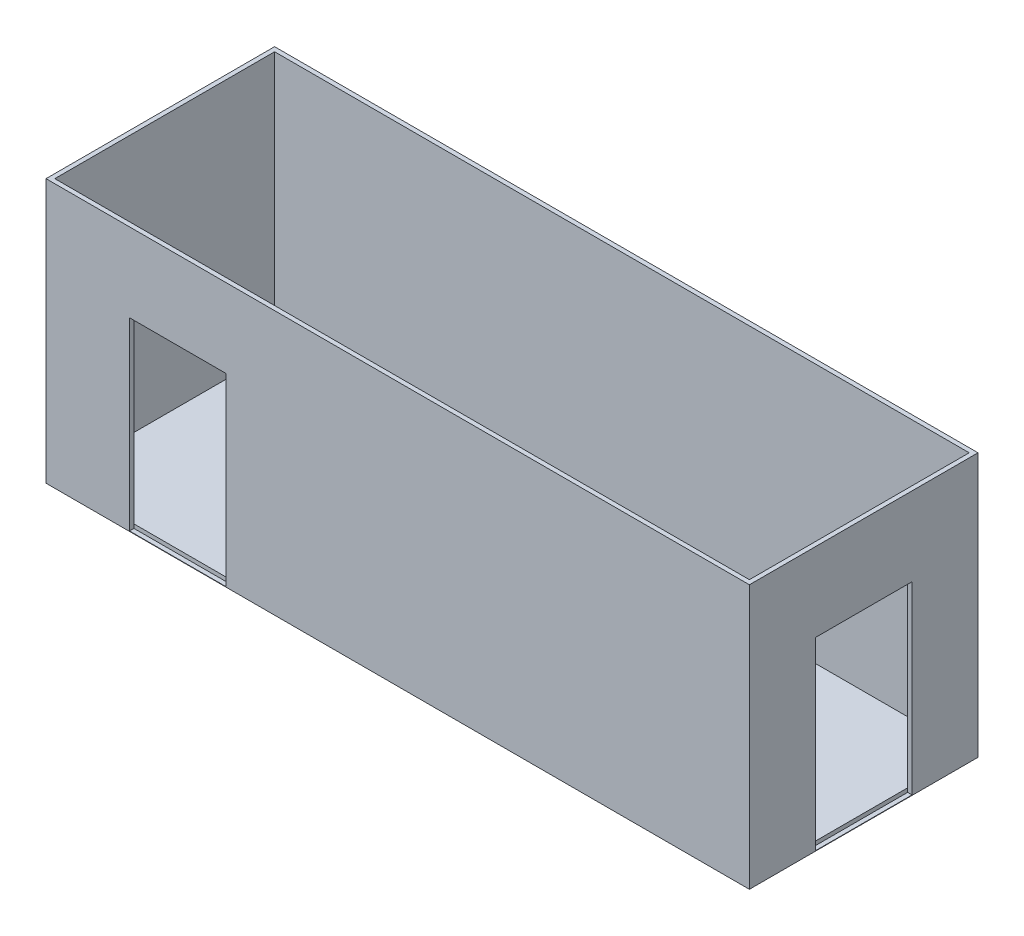
ISO-10303-21;
HEADER;
FILE_DESCRIPTION(('STEP AP214'),'2;1');
FILE_NAME('part.step','',(''),(''),'','','');
FILE_SCHEMA(('AUTOMOTIVE_DESIGN { 1 0 10303 214 1 1 1 1 }'));
ENDSEC;
DATA;
#1=APPLICATION_CONTEXT('core data for automotive mechanical design processes');
#2=APPLICATION_PROTOCOL_DEFINITION('international standard','automotive_design',2000,#1);
#3=PRODUCT_CONTEXT('',#1,'mechanical');
#4=PRODUCT('Part','Part','',(#3));
#5=PRODUCT_RELATED_PRODUCT_CATEGORY('part','',(#4));
#6=PRODUCT_DEFINITION_FORMATION('','',#4);
#7=PRODUCT_DEFINITION_CONTEXT('part definition',#1,'design');
#8=PRODUCT_DEFINITION('design','',#6,#7);
#9=PRODUCT_DEFINITION_SHAPE('','',#8);
#10=(LENGTH_UNIT() NAMED_UNIT(*) SI_UNIT(.MILLI.,.METRE.));
#11=(NAMED_UNIT(*) PLANE_ANGLE_UNIT() SI_UNIT($,.RADIAN.));
#12=(NAMED_UNIT(*) SI_UNIT($,.STERADIAN.) SOLID_ANGLE_UNIT());
#13=UNCERTAINTY_MEASURE_WITH_UNIT(LENGTH_MEASURE(1.E-05),#10,'distance_accuracy_value','');
#14=(GEOMETRIC_REPRESENTATION_CONTEXT(3) GLOBAL_UNCERTAINTY_ASSIGNED_CONTEXT((#13)) GLOBAL_UNIT_ASSIGNED_CONTEXT((#10,
#11,#12)) REPRESENTATION_CONTEXT('',''));
#15=CARTESIAN_POINT('',(0.,0.,0.));
#16=DIRECTION('',(0.,0.,1.));
#17=DIRECTION('',(1.,0.,0.));
#18=AXIS2_PLACEMENT_3D('',#15,#16,#17);
#19=CARTESIAN_POINT('',(-4000.,3000.,1300.));
#20=DIRECTION('',(1.,0.,0.));
#21=DIRECTION('',(0.,0.,-1.));
#22=AXIS2_PLACEMENT_3D('',#19,#20,#21);
#23=PLANE('',#22);
#24=DIRECTION('',(0.,0.,1.));
#25=VECTOR('',#24,1.);
#26=CARTESIAN_POINT('',(-4000.,0.,1300.));
#27=LINE('',#26,#25);
#28=CARTESIAN_POINT('',(-4000.,0.,-1300.));
#29=VERTEX_POINT('',#28);
#30=CARTESIAN_POINT('',(-4000.,0.,1300.));
#31=VERTEX_POINT('',#30);
#32=EDGE_CURVE('E237',#29,#31,#27,.T.);
#33=ORIENTED_EDGE('',*,*,#32,.T.);
#34=DIRECTION('',(0.,-1.,0.));
#35=VECTOR('',#34,1.);
#36=CARTESIAN_POINT('',(-4000.,3000.,1300.));
#37=LINE('',#36,#35);
#38=CARTESIAN_POINT('',(-4000.,3000.,1300.));
#39=VERTEX_POINT('',#38);
#40=EDGE_CURVE('E11',#39,#31,#37,.T.);
#41=ORIENTED_EDGE('',*,*,#40,.F.);
#42=DIRECTION('',(0.,0.,1.));
#43=VECTOR('',#42,1.);
#44=CARTESIAN_POINT('',(-4000.,3000.,1300.));
#45=LINE('',#44,#43);
#46=CARTESIAN_POINT('',(-4000.,3000.,-1300.));
#47=VERTEX_POINT('',#46);
#48=EDGE_CURVE('E266',#47,#39,#45,.T.);
#49=ORIENTED_EDGE('',*,*,#48,.F.);
#50=DIRECTION('',(0.,-1.,0.));
#51=VECTOR('',#50,1.);
#52=CARTESIAN_POINT('',(-4000.,3000.,-1300.));
#53=LINE('',#52,#51);
#54=EDGE_CURVE('E276',#47,#29,#53,.T.);
#55=ORIENTED_EDGE('',*,*,#54,.T.);
#56=EDGE_LOOP('',(#33,#41,#49,#55));
#57=FACE_BOUND('',#56,.T.);
#58=ADVANCED_FACE('F33',(#57),#23,.F.);
#59=CARTESIAN_POINT('',(4000.,3000.,1300.));
#60=DIRECTION('',(0.,0.,-1.));
#61=DIRECTION('',(-1.,0.,0.));
#62=AXIS2_PLACEMENT_3D('',#59,#60,#61);
#63=PLANE('',#62);
#64=DIRECTION('',(1.,0.,0.));
#65=VECTOR('',#64,1.);
#66=CARTESIAN_POINT('',(-3050.,4.99999999999989,1300.));
#67=LINE('',#66,#65);
#68=CARTESIAN_POINT('',(-3050.,4.99999999999989,1300.));
#69=VERTEX_POINT('',#68);
#70=CARTESIAN_POINT('',(-1950.,4.99999999999989,1300.));
#71=VERTEX_POINT('',#70);
#72=EDGE_CURVE('E213',#69,#71,#67,.T.);
#73=ORIENTED_EDGE('',*,*,#72,.F.);
#74=DIRECTION('',(0.,-1.,0.));
#75=VECTOR('',#74,1.);
#76=CARTESIAN_POINT('',(-3050.,2105.,1300.));
#77=LINE('',#76,#75);
#78=CARTESIAN_POINT('',(-3050.,2105.,1300.));
#79=VERTEX_POINT('',#78);
#80=EDGE_CURVE('E194',#79,#69,#77,.T.);
#81=ORIENTED_EDGE('',*,*,#80,.F.);
#82=DIRECTION('',(-1.,0.,0.));
#83=VECTOR('',#82,1.);
#84=CARTESIAN_POINT('',(-3050.,2105.,1300.));
#85=LINE('',#84,#83);
#86=CARTESIAN_POINT('',(-1950.,2105.,1300.));
#87=VERTEX_POINT('',#86);
#88=EDGE_CURVE('E219',#87,#79,#85,.T.);
#89=ORIENTED_EDGE('',*,*,#88,.F.);
#90=DIRECTION('',(0.,1.,0.));
#91=VECTOR('',#90,1.);
#92=CARTESIAN_POINT('',(-1950.,2105.,1300.));
#93=LINE('',#92,#91);
#94=EDGE_CURVE('E216',#71,#87,#93,.T.);
#95=ORIENTED_EDGE('',*,*,#94,.F.);
#96=EDGE_LOOP('',(#73,#81,#89,#95));
#97=FACE_BOUND('',#96,.T.);
#98=DIRECTION('',(1.,0.,0.));
#99=VECTOR('',#98,1.);
#100=CARTESIAN_POINT('',(4000.,0.,1300.));
#101=LINE('',#100,#99);
#102=CARTESIAN_POINT('',(4000.,0.,1300.));
#103=VERTEX_POINT('',#102);
#104=EDGE_CURVE('E279',#31,#103,#101,.T.);
#105=ORIENTED_EDGE('',*,*,#104,.T.);
#106=DIRECTION('',(0.,-1.,0.));
#107=VECTOR('',#106,1.);
#108=CARTESIAN_POINT('',(4000.,3000.,1300.));
#109=LINE('',#108,#107);
#110=CARTESIAN_POINT('',(4000.,3000.,1300.));
#111=VERTEX_POINT('',#110);
#112=EDGE_CURVE('E40',#111,#103,#109,.T.);
#113=ORIENTED_EDGE('',*,*,#112,.F.);
#114=DIRECTION('',(1.,0.,0.));
#115=VECTOR('',#114,1.);
#116=CARTESIAN_POINT('',(4000.,3000.,1300.));
#117=LINE('',#116,#115);
#118=EDGE_CURVE('E269',#39,#111,#117,.T.);
#119=ORIENTED_EDGE('',*,*,#118,.F.);
#120=ORIENTED_EDGE('',*,*,#40,.T.);
#121=EDGE_LOOP('',(#105,#113,#119,#120));
#122=FACE_BOUND('',#121,.T.);
#123=ADVANCED_FACE('F309',(#97,#122),#63,.F.);
#124=CARTESIAN_POINT('',(4000.,3000.,1300.));
#125=DIRECTION('',(-1.,0.,0.));
#126=DIRECTION('',(0.,0.,1.));
#127=AXIS2_PLACEMENT_3D('',#124,#125,#126);
#128=PLANE('',#127);
#129=DIRECTION('',(0.,0.,-1.));
#130=VECTOR('',#129,1.);
#131=CARTESIAN_POINT('',(4000.,4.99999999999989,550.));
#132=LINE('',#131,#130);
#133=CARTESIAN_POINT('',(4000.,4.99999999999989,550.));
#134=VERTEX_POINT('',#133);
#135=CARTESIAN_POINT('',(4000.,4.99999999999989,-550.));
#136=VERTEX_POINT('',#135);
#137=EDGE_CURVE('E185',#134,#136,#132,.T.);
#138=ORIENTED_EDGE('',*,*,#137,.F.);
#139=DIRECTION('',(0.,-1.,0.));
#140=VECTOR('',#139,1.);
#141=CARTESIAN_POINT('',(4000.,2105.,550.));
#142=LINE('',#141,#140);
#143=CARTESIAN_POINT('',(4000.,2105.,550.));
#144=VERTEX_POINT('',#143);
#145=EDGE_CURVE('E47',#144,#134,#142,.T.);
#146=ORIENTED_EDGE('',*,*,#145,.F.);
#147=DIRECTION('',(0.,0.,1.));
#148=VECTOR('',#147,1.);
#149=CARTESIAN_POINT('',(4000.,2105.,550.));
#150=LINE('',#149,#148);
#151=CARTESIAN_POINT('',(4000.,2105.,-550.));
#152=VERTEX_POINT('',#151);
#153=EDGE_CURVE('E166',#152,#144,#150,.T.);
#154=ORIENTED_EDGE('',*,*,#153,.F.);
#155=DIRECTION('',(0.,1.,0.));
#156=VECTOR('',#155,1.);
#157=CARTESIAN_POINT('',(4000.,2105.,-550.));
#158=LINE('',#157,#156);
#159=EDGE_CURVE('E187',#136,#152,#158,.T.);
#160=ORIENTED_EDGE('',*,*,#159,.F.);
#161=EDGE_LOOP('',(#138,#146,#154,#160));
#162=FACE_BOUND('',#161,.T.);
#163=DIRECTION('',(0.,0.,-1.));
#164=VECTOR('',#163,1.);
#165=CARTESIAN_POINT('',(4000.,0.,1300.));
#166=LINE('',#165,#164);
#167=CARTESIAN_POINT('',(4000.,0.,-1300.));
#168=VERTEX_POINT('',#167);
#169=EDGE_CURVE('E281',#103,#168,#166,.T.);
#170=ORIENTED_EDGE('',*,*,#169,.T.);
#171=DIRECTION('',(0.,-1.,0.));
#172=VECTOR('',#171,1.);
#173=CARTESIAN_POINT('',(4000.,3000.,-1300.));
#174=LINE('',#173,#172);
#175=CARTESIAN_POINT('',(4000.,3000.,-1300.));
#176=VERTEX_POINT('',#175);
#177=EDGE_CURVE('E286',#176,#168,#174,.T.);
#178=ORIENTED_EDGE('',*,*,#177,.F.);
#179=DIRECTION('',(0.,0.,-1.));
#180=VECTOR('',#179,1.);
#181=CARTESIAN_POINT('',(4000.,3000.,1300.));
#182=LINE('',#181,#180);
#183=EDGE_CURVE('E272',#111,#176,#182,.T.);
#184=ORIENTED_EDGE('',*,*,#183,.F.);
#185=ORIENTED_EDGE('',*,*,#112,.T.);
#186=EDGE_LOOP('',(#170,#178,#184,#185));
#187=FACE_BOUND('',#186,.T.);
#188=ADVANCED_FACE('F293',(#162,#187),#128,.F.);
#189=CARTESIAN_POINT('',(4000.,3000.,-1300.));
#190=DIRECTION('',(0.,0.,1.));
#191=DIRECTION('',(1.,0.,0.));
#192=AXIS2_PLACEMENT_3D('',#189,#190,#191);
#193=PLANE('',#192);
#194=DIRECTION('',(-1.,0.,0.));
#195=VECTOR('',#194,1.);
#196=CARTESIAN_POINT('',(4000.,0.,-1300.));
#197=LINE('',#196,#195);
#198=EDGE_CURVE('E270',#168,#29,#197,.T.);
#199=ORIENTED_EDGE('',*,*,#198,.T.);
#200=ORIENTED_EDGE('',*,*,#54,.F.);
#201=DIRECTION('',(-1.,0.,0.));
#202=VECTOR('',#201,1.);
#203=CARTESIAN_POINT('',(4000.,3000.,-1300.));
#204=LINE('',#203,#202);
#205=EDGE_CURVE('E274',#176,#47,#204,.T.);
#206=ORIENTED_EDGE('',*,*,#205,.F.);
#207=ORIENTED_EDGE('',*,*,#177,.T.);
#208=EDGE_LOOP('',(#199,#200,#206,#207));
#209=FACE_BOUND('',#208,.T.);
#210=ADVANCED_FACE('F302',(#209),#193,.F.);
#211=CARTESIAN_POINT('',(0.,3000.,0.));
#212=DIRECTION('',(0.,1.,0.));
#213=DIRECTION('',(0.,0.,1.));
#214=AXIS2_PLACEMENT_3D('',#211,#212,#213);
#215=PLANE('',#214);
#216=DIRECTION('',(0.,0.,1.));
#217=VECTOR('',#216,1.);
#218=CARTESIAN_POINT('',(-3950.,3000.,1300.));
#219=LINE('',#218,#217);
#220=CARTESIAN_POINT('',(-3950.,3000.,-1250.));
#221=VERTEX_POINT('',#220);
#222=CARTESIAN_POINT('',(-3950.,3000.,1250.));
#223=VERTEX_POINT('',#222);
#224=EDGE_CURVE('E258',#221,#223,#219,.T.);
#225=ORIENTED_EDGE('',*,*,#224,.F.);
#226=DIRECTION('',(-1.,0.,0.));
#227=VECTOR('',#226,1.);
#228=CARTESIAN_POINT('',(4000.,3000.,-1250.));
#229=LINE('',#228,#227);
#230=CARTESIAN_POINT('',(3950.,3000.,-1250.));
#231=VERTEX_POINT('',#230);
#232=EDGE_CURVE('E243',#231,#221,#229,.T.);
#233=ORIENTED_EDGE('',*,*,#232,.F.);
#234=DIRECTION('',(0.,0.,-1.));
#235=VECTOR('',#234,1.);
#236=CARTESIAN_POINT('',(3950.,3000.,1300.));
#237=LINE('',#236,#235);
#238=CARTESIAN_POINT('',(3950.,3000.,1250.));
#239=VERTEX_POINT('',#238);
#240=EDGE_CURVE('E262',#239,#231,#237,.T.);
#241=ORIENTED_EDGE('',*,*,#240,.F.);
#242=DIRECTION('',(1.,0.,0.));
#243=VECTOR('',#242,1.);
#244=CARTESIAN_POINT('',(4000.,3000.,1250.));
#245=LINE('',#244,#243);
#246=EDGE_CURVE('E260',#223,#239,#245,.T.);
#247=ORIENTED_EDGE('',*,*,#246,.F.);
#248=EDGE_LOOP('',(#225,#233,#241,#247));
#249=FACE_BOUND('',#248,.T.);
#250=ORIENTED_EDGE('',*,*,#48,.T.);
#251=ORIENTED_EDGE('',*,*,#118,.T.);
#252=ORIENTED_EDGE('',*,*,#183,.T.);
#253=ORIENTED_EDGE('',*,*,#205,.T.);
#254=EDGE_LOOP('',(#250,#251,#252,#253));
#255=FACE_BOUND('',#254,.T.);
#256=ADVANCED_FACE('F308',(#249,#255),#215,.T.);
#257=CARTESIAN_POINT('',(0.,0.,0.));
#258=DIRECTION('',(0.,1.,0.));
#259=DIRECTION('',(0.,0.,1.));
#260=AXIS2_PLACEMENT_3D('',#257,#258,#259);
#261=PLANE('',#260);
#262=ORIENTED_EDGE('',*,*,#32,.F.);
#263=ORIENTED_EDGE('',*,*,#198,.F.);
#264=ORIENTED_EDGE('',*,*,#169,.F.);
#265=ORIENTED_EDGE('',*,*,#104,.F.);
#266=EDGE_LOOP('',(#262,#263,#264,#265));
#267=FACE_BOUND('',#266,.T.);
#268=ADVANCED_FACE('F299',(#267),#261,.F.);
#269=CARTESIAN_POINT('',(-3950.,3000.,1300.));
#270=DIRECTION('',(1.,0.,0.));
#271=DIRECTION('',(0.,0.,-1.));
#272=AXIS2_PLACEMENT_3D('',#269,#270,#271);
#273=PLANE('',#272);
#274=DIRECTION('',(0.,0.,1.));
#275=VECTOR('',#274,1.);
#276=CARTESIAN_POINT('',(-3950.,49.9999999999998,1300.));
#277=LINE('',#276,#275);
#278=CARTESIAN_POINT('',(-3950.,50.,-1250.));
#279=VERTEX_POINT('',#278);
#280=CARTESIAN_POINT('',(-3950.,50.,1250.));
#281=VERTEX_POINT('',#280);
#282=EDGE_CURVE('E224',#279,#281,#277,.T.);
#283=ORIENTED_EDGE('',*,*,#282,.F.);
#284=DIRECTION('',(0.,-1.,0.));
#285=VECTOR('',#284,1.);
#286=CARTESIAN_POINT('',(-3950.,3000.,-1250.));
#287=LINE('',#286,#285);
#288=EDGE_CURVE('E239',#221,#279,#287,.T.);
#289=ORIENTED_EDGE('',*,*,#288,.F.);
#290=ORIENTED_EDGE('',*,*,#224,.T.);
#291=DIRECTION('',(0.,-1.,0.));
#292=VECTOR('',#291,1.);
#293=CARTESIAN_POINT('',(-3950.,3000.,1250.));
#294=LINE('',#293,#292);
#295=EDGE_CURVE('E234',#223,#281,#294,.T.);
#296=ORIENTED_EDGE('',*,*,#295,.T.);
#297=EDGE_LOOP('',(#283,#289,#290,#296));
#298=FACE_BOUND('',#297,.T.);
#299=ADVANCED_FACE('F324',(#298),#273,.T.);
#300=CARTESIAN_POINT('',(4000.,3000.,1250.));
#301=DIRECTION('',(0.,0.,-1.));
#302=DIRECTION('',(-1.,0.,0.));
#303=AXIS2_PLACEMENT_3D('',#300,#301,#302);
#304=PLANE('',#303);
#305=DIRECTION('',(0.,-1.,0.));
#306=VECTOR('',#305,1.);
#307=CARTESIAN_POINT('',(-3050.,2105.,1250.));
#308=LINE('',#307,#306);
#309=CARTESIAN_POINT('',(-3050.,2105.,1250.));
#310=VERTEX_POINT('',#309);
#311=CARTESIAN_POINT('',(-3050.,49.9999999999998,1250.));
#312=VERTEX_POINT('',#311);
#313=EDGE_CURVE('E198',#310,#312,#308,.T.);
#314=ORIENTED_EDGE('',*,*,#313,.T.);
#315=DIRECTION('',(1.,0.,0.));
#316=VECTOR('',#315,1.);
#317=CARTESIAN_POINT('',(4000.,49.9999999999998,1250.));
#318=LINE('',#317,#316);
#319=EDGE_CURVE('E244',#281,#312,#318,.T.);
#320=ORIENTED_EDGE('',*,*,#319,.F.);
#321=ORIENTED_EDGE('',*,*,#295,.F.);
#322=ORIENTED_EDGE('',*,*,#246,.T.);
#323=DIRECTION('',(0.,-1.,0.));
#324=VECTOR('',#323,1.);
#325=CARTESIAN_POINT('',(3950.,3000.,1250.));
#326=LINE('',#325,#324);
#327=CARTESIAN_POINT('',(3950.,50.,1250.));
#328=VERTEX_POINT('',#327);
#329=EDGE_CURVE('E238',#239,#328,#326,.T.);
#330=ORIENTED_EDGE('',*,*,#329,.T.);
#331=CARTESIAN_POINT('',(-1950.,49.9999999999998,1250.));
#332=VERTEX_POINT('',#331);
#333=EDGE_CURVE('E233',#332,#328,#318,.T.);
#334=ORIENTED_EDGE('',*,*,#333,.F.);
#335=DIRECTION('',(0.,1.,0.));
#336=VECTOR('',#335,1.);
#337=CARTESIAN_POINT('',(-1950.,2105.,1250.));
#338=LINE('',#337,#336);
#339=CARTESIAN_POINT('',(-1950.,2105.,1250.));
#340=VERTEX_POINT('',#339);
#341=EDGE_CURVE('E205',#332,#340,#338,.T.);
#342=ORIENTED_EDGE('',*,*,#341,.T.);
#343=DIRECTION('',(-1.,0.,0.));
#344=VECTOR('',#343,1.);
#345=CARTESIAN_POINT('',(-3050.,2105.,1250.));
#346=LINE('',#345,#344);
#347=EDGE_CURVE('E208',#340,#310,#346,.T.);
#348=ORIENTED_EDGE('',*,*,#347,.T.);
#349=EDGE_LOOP('',(#314,#320,#321,#322,#330,#334,#342,#348));
#350=FACE_BOUND('',#349,.T.);
#351=ADVANCED_FACE('F340',(#350),#304,.T.);
#352=CARTESIAN_POINT('',(3950.,3000.,1300.));
#353=DIRECTION('',(-1.,0.,0.));
#354=DIRECTION('',(0.,0.,1.));
#355=AXIS2_PLACEMENT_3D('',#352,#353,#354);
#356=PLANE('',#355);
#357=DIRECTION('',(0.,-1.,0.));
#358=VECTOR('',#357,1.);
#359=CARTESIAN_POINT('',(3950.,2105.,550.));
#360=LINE('',#359,#358);
#361=CARTESIAN_POINT('',(3950.,2105.,550.));
#362=VERTEX_POINT('',#361);
#363=CARTESIAN_POINT('',(3950.,49.9999999999998,550.));
#364=VERTEX_POINT('',#363);
#365=EDGE_CURVE('E165',#362,#364,#360,.T.);
#366=ORIENTED_EDGE('',*,*,#365,.T.);
#367=DIRECTION('',(0.,0.,-1.));
#368=VECTOR('',#367,1.);
#369=CARTESIAN_POINT('',(3950.,49.9999999999998,1300.));
#370=LINE('',#369,#368);
#371=EDGE_CURVE('E251',#328,#364,#370,.T.);
#372=ORIENTED_EDGE('',*,*,#371,.F.);
#373=ORIENTED_EDGE('',*,*,#329,.F.);
#374=ORIENTED_EDGE('',*,*,#240,.T.);
#375=DIRECTION('',(0.,-1.,0.));
#376=VECTOR('',#375,1.);
#377=CARTESIAN_POINT('',(3950.,3000.,-1250.));
#378=LINE('',#377,#376);
#379=CARTESIAN_POINT('',(3950.,50.,-1250.));
#380=VERTEX_POINT('',#379);
#381=EDGE_CURVE('E242',#231,#380,#378,.T.);
#382=ORIENTED_EDGE('',*,*,#381,.T.);
#383=CARTESIAN_POINT('',(3950.,49.9999999999998,-550.));
#384=VERTEX_POINT('',#383);
#385=EDGE_CURVE('E247',#384,#380,#370,.T.);
#386=ORIENTED_EDGE('',*,*,#385,.F.);
#387=DIRECTION('',(0.,1.,0.));
#388=VECTOR('',#387,1.);
#389=CARTESIAN_POINT('',(3950.,2105.,-550.));
#390=LINE('',#389,#388);
#391=CARTESIAN_POINT('',(3950.,2105.,-550.));
#392=VERTEX_POINT('',#391);
#393=EDGE_CURVE('E177',#384,#392,#390,.T.);
#394=ORIENTED_EDGE('',*,*,#393,.T.);
#395=DIRECTION('',(0.,0.,1.));
#396=VECTOR('',#395,1.);
#397=CARTESIAN_POINT('',(3950.,2105.,550.));
#398=LINE('',#397,#396);
#399=EDGE_CURVE('E174',#392,#362,#398,.T.);
#400=ORIENTED_EDGE('',*,*,#399,.T.);
#401=EDGE_LOOP('',(#366,#372,#373,#374,#382,#386,#394,#400));
#402=FACE_BOUND('',#401,.T.);
#403=ADVANCED_FACE('F336',(#402),#356,.T.);
#404=CARTESIAN_POINT('',(4000.,3000.,-1250.));
#405=DIRECTION('',(0.,0.,1.));
#406=DIRECTION('',(1.,0.,0.));
#407=AXIS2_PLACEMENT_3D('',#404,#405,#406);
#408=PLANE('',#407);
#409=DIRECTION('',(-1.,0.,0.));
#410=VECTOR('',#409,1.);
#411=CARTESIAN_POINT('',(4000.,49.9999999999998,-1250.));
#412=LINE('',#411,#410);
#413=EDGE_CURVE('E254',#380,#279,#412,.T.);
#414=ORIENTED_EDGE('',*,*,#413,.F.);
#415=ORIENTED_EDGE('',*,*,#381,.F.);
#416=ORIENTED_EDGE('',*,*,#232,.T.);
#417=ORIENTED_EDGE('',*,*,#288,.T.);
#418=EDGE_LOOP('',(#414,#415,#416,#417));
#419=FACE_BOUND('',#418,.T.);
#420=ADVANCED_FACE('F332',(#419),#408,.T.);
#421=CARTESIAN_POINT('',(0.,50.,0.));
#422=DIRECTION('',(0.,1.,0.));
#423=DIRECTION('',(0.,0.,1.));
#424=AXIS2_PLACEMENT_3D('',#421,#422,#423);
#425=PLANE('',#424);
#426=ORIENTED_EDGE('',*,*,#282,.T.);
#427=ORIENTED_EDGE('',*,*,#319,.T.);
#428=EDGE_CURVE('E248',#312,#332,#318,.T.);
#429=ORIENTED_EDGE('',*,*,#428,.T.);
#430=ORIENTED_EDGE('',*,*,#333,.T.);
#431=ORIENTED_EDGE('',*,*,#371,.T.);
#432=EDGE_CURVE('E162',#364,#384,#370,.T.);
#433=ORIENTED_EDGE('',*,*,#432,.T.);
#434=ORIENTED_EDGE('',*,*,#385,.T.);
#435=ORIENTED_EDGE('',*,*,#413,.T.);
#436=EDGE_LOOP('',(#426,#427,#429,#430,#431,#433,#434,#435));
#437=FACE_BOUND('',#436,.T.);
#438=ADVANCED_FACE('F328',(#437),#425,.T.);
#439=CARTESIAN_POINT('',(-3050.,2105.,1250.));
#440=DIRECTION('',(-1.,0.,0.));
#441=DIRECTION('',(0.,-1.,0.));
#442=AXIS2_PLACEMENT_3D('',#439,#440,#441);
#443=PLANE('',#442);
#444=ORIENTED_EDGE('',*,*,#80,.T.);
#445=DIRECTION('',(0.,0.,1.));
#446=VECTOR('',#445,1.);
#447=CARTESIAN_POINT('',(-3050.,4.99999999999989,1250.));
#448=LINE('',#447,#446);
#449=CARTESIAN_POINT('',(-3050.,4.99999999999989,1250.));
#450=VERTEX_POINT('',#449);
#451=EDGE_CURVE('E211',#450,#69,#448,.T.);
#452=ORIENTED_EDGE('',*,*,#451,.F.);
#453=EDGE_CURVE('E202',#312,#450,#308,.T.);
#454=ORIENTED_EDGE('',*,*,#453,.F.);
#455=ORIENTED_EDGE('',*,*,#313,.F.);
#456=DIRECTION('',(0.,0.,1.));
#457=VECTOR('',#456,1.);
#458=CARTESIAN_POINT('',(-3050.,2105.,1250.));
#459=LINE('',#458,#457);
#460=EDGE_CURVE('E222',#310,#79,#459,.T.);
#461=ORIENTED_EDGE('',*,*,#460,.T.);
#462=EDGE_LOOP('',(#444,#452,#454,#455,#461));
#463=FACE_BOUND('',#462,.T.);
#464=ADVANCED_FACE('F331',(#463),#443,.F.);
#465=CARTESIAN_POINT('',(-3050.,2105.,1250.));
#466=DIRECTION('',(0.,1.,0.));
#467=DIRECTION('',(0.,0.,1.));
#468=AXIS2_PLACEMENT_3D('',#465,#466,#467);
#469=PLANE('',#468);
#470=ORIENTED_EDGE('',*,*,#88,.T.);
#471=ORIENTED_EDGE('',*,*,#460,.F.);
#472=ORIENTED_EDGE('',*,*,#347,.F.);
#473=DIRECTION('',(0.,0.,1.));
#474=VECTOR('',#473,1.);
#475=CARTESIAN_POINT('',(-1950.,2105.,1250.));
#476=LINE('',#475,#474);
#477=EDGE_CURVE('E225',#340,#87,#476,.T.);
#478=ORIENTED_EDGE('',*,*,#477,.T.);
#479=EDGE_LOOP('',(#470,#471,#472,#478));
#480=FACE_BOUND('',#479,.T.);
#481=ADVANCED_FACE('F350',(#480),#469,.F.);
#482=CARTESIAN_POINT('',(-1950.,2105.,1250.));
#483=DIRECTION('',(1.,0.,0.));
#484=DIRECTION('',(0.,1.,0.));
#485=AXIS2_PLACEMENT_3D('',#482,#483,#484);
#486=PLANE('',#485);
#487=ORIENTED_EDGE('',*,*,#94,.T.);
#488=ORIENTED_EDGE('',*,*,#477,.F.);
#489=ORIENTED_EDGE('',*,*,#341,.F.);
#490=CARTESIAN_POINT('',(-1950.,4.99999999999989,1250.));
#491=VERTEX_POINT('',#490);
#492=EDGE_CURVE('E206',#491,#332,#338,.T.);
#493=ORIENTED_EDGE('',*,*,#492,.F.);
#494=DIRECTION('',(0.,0.,1.));
#495=VECTOR('',#494,1.);
#496=CARTESIAN_POINT('',(-1950.,4.99999999999989,1250.));
#497=LINE('',#496,#495);
#498=EDGE_CURVE('E227',#491,#71,#497,.T.);
#499=ORIENTED_EDGE('',*,*,#498,.T.);
#500=EDGE_LOOP('',(#487,#488,#489,#493,#499));
#501=FACE_BOUND('',#500,.T.);
#502=ADVANCED_FACE('F356',(#501),#486,.F.);
#503=CARTESIAN_POINT('',(-3050.,4.99999999999989,1250.));
#504=DIRECTION('',(0.,-1.,0.));
#505=DIRECTION('',(0.,0.,-1.));
#506=AXIS2_PLACEMENT_3D('',#503,#504,#505);
#507=PLANE('',#506);
#508=ORIENTED_EDGE('',*,*,#72,.T.);
#509=ORIENTED_EDGE('',*,*,#498,.F.);
#510=DIRECTION('',(1.,0.,0.));
#511=VECTOR('',#510,1.);
#512=CARTESIAN_POINT('',(-3050.,4.99999999999989,1250.));
#513=LINE('',#512,#511);
#514=EDGE_CURVE('E201',#450,#491,#513,.T.);
#515=ORIENTED_EDGE('',*,*,#514,.F.);
#516=ORIENTED_EDGE('',*,*,#451,.T.);
#517=EDGE_LOOP('',(#508,#509,#515,#516));
#518=FACE_BOUND('',#517,.T.);
#519=ADVANCED_FACE('F352',(#518),#507,.F.);
#520=CARTESIAN_POINT('',(0.,0.,1250.));
#521=DIRECTION('',(0.,0.,1.));
#522=DIRECTION('',(1.,0.,0.));
#523=AXIS2_PLACEMENT_3D('',#520,#521,#522);
#524=PLANE('',#523);
#525=ORIENTED_EDGE('',*,*,#453,.T.);
#526=ORIENTED_EDGE('',*,*,#514,.T.);
#527=ORIENTED_EDGE('',*,*,#492,.T.);
#528=ORIENTED_EDGE('',*,*,#428,.F.);
#529=EDGE_LOOP('',(#525,#526,#527,#528));
#530=FACE_BOUND('',#529,.T.);
#531=ADVANCED_FACE('F355',(#530),#524,.T.);
#532=CARTESIAN_POINT('',(3950.,2105.,550.));
#533=DIRECTION('',(0.,0.,1.));
#534=DIRECTION('',(0.,-1.,0.));
#535=AXIS2_PLACEMENT_3D('',#532,#533,#534);
#536=PLANE('',#535);
#537=ORIENTED_EDGE('',*,*,#145,.T.);
#538=DIRECTION('',(1.,0.,0.));
#539=VECTOR('',#538,1.);
#540=CARTESIAN_POINT('',(3950.,4.99999999999989,550.));
#541=LINE('',#540,#539);
#542=CARTESIAN_POINT('',(3950.,4.99999999999989,550.));
#543=VERTEX_POINT('',#542);
#544=EDGE_CURVE('E168',#543,#134,#541,.T.);
#545=ORIENTED_EDGE('',*,*,#544,.F.);
#546=EDGE_CURVE('E157',#364,#543,#360,.T.);
#547=ORIENTED_EDGE('',*,*,#546,.F.);
#548=ORIENTED_EDGE('',*,*,#365,.F.);
#549=DIRECTION('',(1.,0.,0.));
#550=VECTOR('',#549,1.);
#551=CARTESIAN_POINT('',(3950.,2105.,550.));
#552=LINE('',#551,#550);
#553=EDGE_CURVE('E192',#362,#144,#552,.T.);
#554=ORIENTED_EDGE('',*,*,#553,.T.);
#555=EDGE_LOOP('',(#537,#545,#547,#548,#554));
#556=FACE_BOUND('',#555,.T.);
#557=ADVANCED_FACE('F169',(#556),#536,.F.);
#558=CARTESIAN_POINT('',(3950.,2105.,550.));
#559=DIRECTION('',(0.,1.,0.));
#560=DIRECTION('',(0.,0.,1.));
#561=AXIS2_PLACEMENT_3D('',#558,#559,#560);
#562=PLANE('',#561);
#563=ORIENTED_EDGE('',*,*,#153,.T.);
#564=ORIENTED_EDGE('',*,*,#553,.F.);
#565=ORIENTED_EDGE('',*,*,#399,.F.);
#566=DIRECTION('',(1.,0.,0.));
#567=VECTOR('',#566,1.);
#568=CARTESIAN_POINT('',(3950.,2105.,-550.));
#569=LINE('',#568,#567);
#570=EDGE_CURVE('E195',#392,#152,#569,.T.);
#571=ORIENTED_EDGE('',*,*,#570,.T.);
#572=EDGE_LOOP('',(#563,#564,#565,#571));
#573=FACE_BOUND('',#572,.T.);
#574=ADVANCED_FACE('F369',(#573),#562,.F.);
#575=CARTESIAN_POINT('',(3950.,2105.,-550.));
#576=DIRECTION('',(0.,0.,-1.));
#577=DIRECTION('',(0.,1.,0.));
#578=AXIS2_PLACEMENT_3D('',#575,#576,#577);
#579=PLANE('',#578);
#580=ORIENTED_EDGE('',*,*,#159,.T.);
#581=ORIENTED_EDGE('',*,*,#570,.F.);
#582=ORIENTED_EDGE('',*,*,#393,.F.);
#583=CARTESIAN_POINT('',(3950.,4.99999999999989,-550.));
#584=VERTEX_POINT('',#583);
#585=EDGE_CURVE('E55',#584,#384,#390,.T.);
#586=ORIENTED_EDGE('',*,*,#585,.F.);
#587=DIRECTION('',(1.,0.,0.));
#588=VECTOR('',#587,1.);
#589=CARTESIAN_POINT('',(3950.,4.99999999999989,-550.));
#590=LINE('',#589,#588);
#591=EDGE_CURVE('E173',#584,#136,#590,.T.);
#592=ORIENTED_EDGE('',*,*,#591,.T.);
#593=EDGE_LOOP('',(#580,#581,#582,#586,#592));
#594=FACE_BOUND('',#593,.T.);
#595=ADVANCED_FACE('F372',(#594),#579,.F.);
#596=CARTESIAN_POINT('',(3950.,4.99999999999989,550.));
#597=DIRECTION('',(0.,-1.,0.));
#598=DIRECTION('',(0.,0.,-1.));
#599=AXIS2_PLACEMENT_3D('',#596,#597,#598);
#600=PLANE('',#599);
#601=ORIENTED_EDGE('',*,*,#137,.T.);
#602=ORIENTED_EDGE('',*,*,#591,.F.);
#603=DIRECTION('',(0.,0.,-1.));
#604=VECTOR('',#603,1.);
#605=CARTESIAN_POINT('',(3950.,4.99999999999989,550.));
#606=LINE('',#605,#604);
#607=EDGE_CURVE('E160',#543,#584,#606,.T.);
#608=ORIENTED_EDGE('',*,*,#607,.F.);
#609=ORIENTED_EDGE('',*,*,#544,.T.);
#610=EDGE_LOOP('',(#601,#602,#608,#609));
#611=FACE_BOUND('',#610,.T.);
#612=ADVANCED_FACE('F176',(#611),#600,.F.);
#613=CARTESIAN_POINT('',(3950.,0.,0.));
#614=DIRECTION('',(1.,0.,0.));
#615=DIRECTION('',(0.,0.,-1.));
#616=AXIS2_PLACEMENT_3D('',#613,#614,#615);
#617=PLANE('',#616);
#618=ORIENTED_EDGE('',*,*,#546,.T.);
#619=ORIENTED_EDGE('',*,*,#607,.T.);
#620=ORIENTED_EDGE('',*,*,#585,.T.);
#621=ORIENTED_EDGE('',*,*,#432,.F.);
#622=EDGE_LOOP('',(#618,#619,#620,#621));
#623=FACE_BOUND('',#622,.T.);
#624=ADVANCED_FACE('F158',(#623),#617,.T.);
#625=CLOSED_SHELL('',(#58,#123,#188,#210,#256,#268,#299,#351,#403,#420,#438,#464,#481,#502,#519,
#531,#557,#574,#595,#612,#624));
#626=MANIFOLD_SOLID_BREP('B2',#625);
#627=ADVANCED_BREP_SHAPE_REPRESENTATION('',(#18,#626),#14);
#628=SHAPE_DEFINITION_REPRESENTATION(#9,#627);
ENDSEC;
END-ISO-10303-21;
